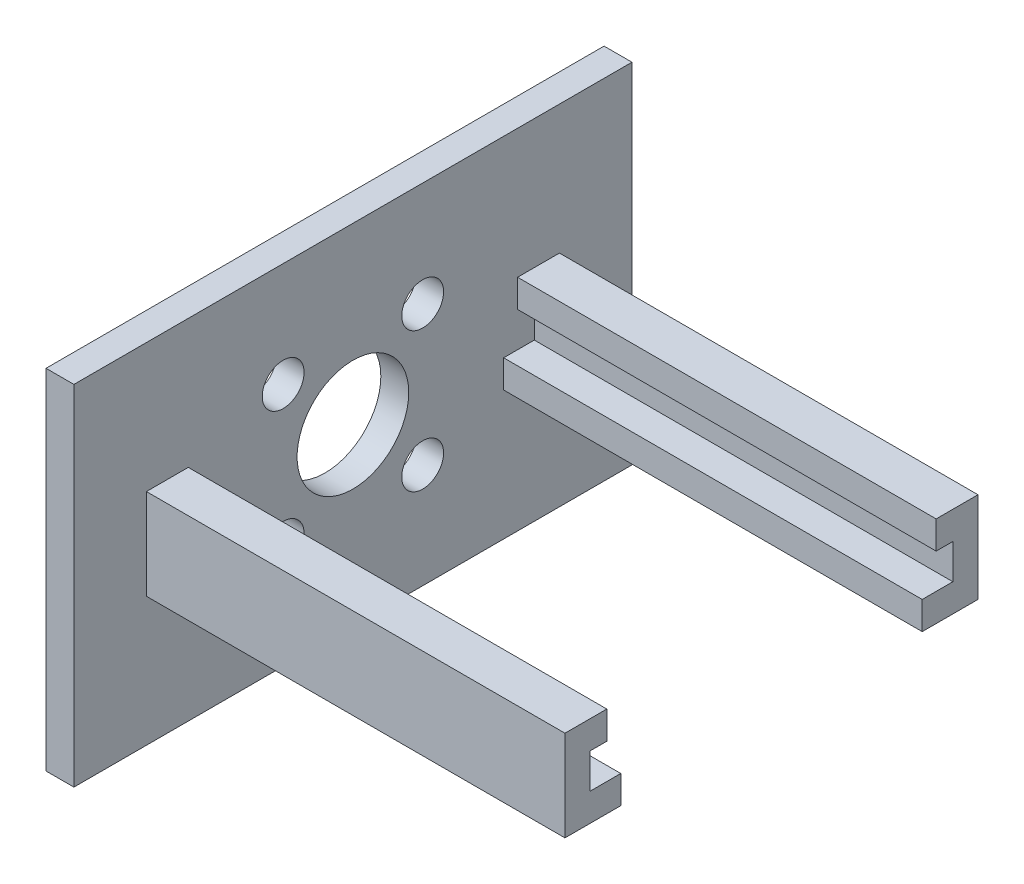
ISO-10303-21;
HEADER;
FILE_DESCRIPTION(('STEP AP214'),'2;1');
FILE_NAME('part.step','',(''),(''),'','','');
FILE_SCHEMA(('AUTOMOTIVE_DESIGN { 1 0 10303 214 1 1 1 1 }'));
ENDSEC;
DATA;
#1=APPLICATION_CONTEXT('core data for automotive mechanical design processes');
#2=APPLICATION_PROTOCOL_DEFINITION('international standard','automotive_design',2000,#1);
#3=PRODUCT_CONTEXT('',#1,'mechanical');
#4=PRODUCT('Part','Part','',(#3));
#5=PRODUCT_RELATED_PRODUCT_CATEGORY('part','',(#4));
#6=PRODUCT_DEFINITION_FORMATION('','',#4);
#7=PRODUCT_DEFINITION_CONTEXT('part definition',#1,'design');
#8=PRODUCT_DEFINITION('design','',#6,#7);
#9=PRODUCT_DEFINITION_SHAPE('','',#8);
#10=(LENGTH_UNIT() NAMED_UNIT(*) SI_UNIT(.MILLI.,.METRE.));
#11=(NAMED_UNIT(*) PLANE_ANGLE_UNIT() SI_UNIT($,.RADIAN.));
#12=(NAMED_UNIT(*) SI_UNIT($,.STERADIAN.) SOLID_ANGLE_UNIT());
#13=UNCERTAINTY_MEASURE_WITH_UNIT(LENGTH_MEASURE(1.E-05),#10,'distance_accuracy_value','');
#14=(GEOMETRIC_REPRESENTATION_CONTEXT(3) GLOBAL_UNCERTAINTY_ASSIGNED_CONTEXT((#13)) GLOBAL_UNIT_ASSIGNED_CONTEXT((#10,
#11,#12)) REPRESENTATION_CONTEXT('',''));
#15=CARTESIAN_POINT('',(0.,0.,0.));
#16=DIRECTION('',(0.,0.,1.));
#17=DIRECTION('',(1.,0.,0.));
#18=AXIS2_PLACEMENT_3D('',#15,#16,#17);
#19=CARTESIAN_POINT('',(2.,0.,0.));
#20=DIRECTION('',(1.,0.,0.));
#21=DIRECTION('',(0.,0.,-1.));
#22=AXIS2_PLACEMENT_3D('',#19,#20,#21);
#23=PLANE('',#22);
#24=CARTESIAN_POINT('',(2.,-5.,-5.));
#25=DIRECTION('',(1.,0.,0.));
#26=DIRECTION('',(0.,0.,-1.));
#27=AXIS2_PLACEMENT_3D('',#24,#25,#26);
#28=CIRCLE('',#27,1.5);
#29=CARTESIAN_POINT('',(2.,-5.,-6.5));
#30=VERTEX_POINT('',#29);
#31=EDGE_CURVE('E687',#30,#30,#28,.T.);
#32=ORIENTED_EDGE('',*,*,#31,.F.);
#33=EDGE_LOOP('',(#32));
#34=FACE_BOUND('',#33,.T.);
#35=CARTESIAN_POINT('',(2.,-5.,5.));
#36=DIRECTION('',(1.,0.,0.));
#37=DIRECTION('',(0.,0.,-1.));
#38=AXIS2_PLACEMENT_3D('',#35,#36,#37);
#39=CIRCLE('',#38,1.5);
#40=CARTESIAN_POINT('',(2.,-5.,3.5));
#41=VERTEX_POINT('',#40);
#42=EDGE_CURVE('E688',#41,#41,#39,.T.);
#43=ORIENTED_EDGE('',*,*,#42,.F.);
#44=EDGE_LOOP('',(#43));
#45=FACE_BOUND('',#44,.T.);
#46=CARTESIAN_POINT('',(2.,0.,0.));
#47=DIRECTION('',(1.,0.,0.));
#48=DIRECTION('',(0.,0.,-1.));
#49=AXIS2_PLACEMENT_3D('',#46,#47,#48);
#50=CIRCLE('',#49,4.);
#51=CARTESIAN_POINT('',(2.,0.,-4.));
#52=VERTEX_POINT('',#51);
#53=EDGE_CURVE('E696',#52,#52,#50,.T.);
#54=ORIENTED_EDGE('',*,*,#53,.F.);
#55=EDGE_LOOP('',(#54));
#56=FACE_BOUND('',#55,.T.);
#57=CARTESIAN_POINT('',(2.,5.,5.));
#58=DIRECTION('',(1.,0.,0.));
#59=DIRECTION('',(0.,0.,-1.));
#60=AXIS2_PLACEMENT_3D('',#57,#58,#59);
#61=CIRCLE('',#60,1.5);
#62=CARTESIAN_POINT('',(2.,5.,3.5));
#63=VERTEX_POINT('',#62);
#64=EDGE_CURVE('E692',#63,#63,#61,.T.);
#65=ORIENTED_EDGE('',*,*,#64,.F.);
#66=EDGE_LOOP('',(#65));
#67=FACE_BOUND('',#66,.T.);
#68=CARTESIAN_POINT('',(2.,5.,-5.));
#69=DIRECTION('',(1.,0.,0.));
#70=DIRECTION('',(0.,0.,-1.));
#71=AXIS2_PLACEMENT_3D('',#68,#69,#70);
#72=CIRCLE('',#71,1.5);
#73=CARTESIAN_POINT('',(2.,5.,-6.5));
#74=VERTEX_POINT('',#73);
#75=EDGE_CURVE('E308',#74,#74,#72,.T.);
#76=ORIENTED_EDGE('',*,*,#75,.F.);
#77=EDGE_LOOP('',(#76));
#78=FACE_BOUND('',#77,.T.);
#79=DIRECTION('',(0.,-1.,0.));
#80=VECTOR('',#79,1.);
#81=CARTESIAN_POINT('',(2.,12.5,20.));
#82=LINE('',#81,#80);
#83=CARTESIAN_POINT('',(2.,12.5,20.));
#84=VERTEX_POINT('',#83);
#85=CARTESIAN_POINT('',(2.,-12.5,20.));
#86=VERTEX_POINT('',#85);
#87=EDGE_CURVE('E275',#84,#86,#82,.T.);
#88=ORIENTED_EDGE('',*,*,#87,.T.);
#89=DIRECTION('',(0.,0.,-1.));
#90=VECTOR('',#89,1.);
#91=CARTESIAN_POINT('',(2.,-12.5,20.));
#92=LINE('',#91,#90);
#93=CARTESIAN_POINT('',(2.,-12.5,-20.));
#94=VERTEX_POINT('',#93);
#95=EDGE_CURVE('E278',#86,#94,#92,.T.);
#96=ORIENTED_EDGE('',*,*,#95,.T.);
#97=DIRECTION('',(0.,1.,0.));
#98=VECTOR('',#97,1.);
#99=CARTESIAN_POINT('',(2.,12.5,-20.));
#100=LINE('',#99,#98);
#101=CARTESIAN_POINT('',(2.,12.5,-20.));
#102=VERTEX_POINT('',#101);
#103=EDGE_CURVE('E281',#94,#102,#100,.T.);
#104=ORIENTED_EDGE('',*,*,#103,.T.);
#105=DIRECTION('',(0.,0.,1.));
#106=VECTOR('',#105,1.);
#107=CARTESIAN_POINT('',(2.,12.5,20.));
#108=LINE('',#107,#106);
#109=EDGE_CURVE('E284',#102,#84,#108,.T.);
#110=ORIENTED_EDGE('',*,*,#109,.T.);
#111=EDGE_LOOP('',(#88,#96,#104,#110));
#112=FACE_BOUND('',#111,.T.);
#113=DIRECTION('',(0.,0.,1.));
#114=VECTOR('',#113,1.);
#115=CARTESIAN_POINT('',(2.,3.25,-11.802707792877));
#116=LINE('',#115,#114);
#117=CARTESIAN_POINT('',(2.,3.25,-14.802707792877));
#118=VERTEX_POINT('',#117);
#119=CARTESIAN_POINT('',(2.,3.25,-11.802707792877));
#120=VERTEX_POINT('',#119);
#121=EDGE_CURVE('E204',#118,#120,#116,.T.);
#122=ORIENTED_EDGE('',*,*,#121,.F.);
#123=DIRECTION('',(0.,1.,0.));
#124=VECTOR('',#123,1.);
#125=CARTESIAN_POINT('',(2.,3.25,-14.802707792877));
#126=LINE('',#125,#124);
#127=CARTESIAN_POINT('',(2.,-3.25,-14.802707792877));
#128=VERTEX_POINT('',#127);
#129=EDGE_CURVE('E201',#128,#118,#126,.T.);
#130=ORIENTED_EDGE('',*,*,#129,.F.);
#131=DIRECTION('',(0.,0.,-1.));
#132=VECTOR('',#131,1.);
#133=CARTESIAN_POINT('',(2.,-3.25,-14.802707792877));
#134=LINE('',#133,#132);
#135=CARTESIAN_POINT('',(2.,-3.25,-10.802707792877));
#136=VERTEX_POINT('',#135);
#137=EDGE_CURVE('E228',#136,#128,#134,.T.);
#138=ORIENTED_EDGE('',*,*,#137,.F.);
#139=DIRECTION('',(0.,-1.,0.));
#140=VECTOR('',#139,1.);
#141=CARTESIAN_POINT('',(2.,-3.25,-10.802707792877));
#142=LINE('',#141,#140);
#143=CARTESIAN_POINT('',(2.,-1.25,-10.802707792877));
#144=VERTEX_POINT('',#143);
#145=EDGE_CURVE('E252',#144,#136,#142,.T.);
#146=ORIENTED_EDGE('',*,*,#145,.F.);
#147=DIRECTION('',(0.,0.,1.));
#148=VECTOR('',#147,1.);
#149=CARTESIAN_POINT('',(2.,-1.25,-10.802707792877));
#150=LINE('',#149,#148);
#151=CARTESIAN_POINT('',(2.,-1.25,-13.));
#152=VERTEX_POINT('',#151);
#153=EDGE_CURVE('E250',#152,#144,#150,.T.);
#154=ORIENTED_EDGE('',*,*,#153,.F.);
#155=DIRECTION('',(0.,-1.,0.));
#156=VECTOR('',#155,1.);
#157=CARTESIAN_POINT('',(2.,-1.25,-13.));
#158=LINE('',#157,#156);
#159=CARTESIAN_POINT('',(2.,1.25,-13.));
#160=VERTEX_POINT('',#159);
#161=EDGE_CURVE('E248',#160,#152,#158,.T.);
#162=ORIENTED_EDGE('',*,*,#161,.F.);
#163=DIRECTION('',(0.,0.,-1.));
#164=VECTOR('',#163,1.);
#165=CARTESIAN_POINT('',(2.,1.25,-13.));
#166=LINE('',#165,#164);
#167=CARTESIAN_POINT('',(2.,1.25,-11.802707792877));
#168=VERTEX_POINT('',#167);
#169=EDGE_CURVE('E246',#168,#160,#166,.T.);
#170=ORIENTED_EDGE('',*,*,#169,.F.);
#171=DIRECTION('',(0.,-1.,0.));
#172=VECTOR('',#171,1.);
#173=CARTESIAN_POINT('',(2.,1.25,-11.802707792877));
#174=LINE('',#173,#172);
#175=EDGE_CURVE('E244',#120,#168,#174,.T.);
#176=ORIENTED_EDGE('',*,*,#175,.F.);
#177=EDGE_LOOP('',(#122,#130,#138,#146,#154,#162,#170,#176));
#178=FACE_BOUND('',#177,.T.);
#179=DIRECTION('',(0.,1.,0.));
#180=VECTOR('',#179,1.);
#181=CARTESIAN_POINT('',(2.,-1.25,13.));
#182=LINE('',#181,#180);
#183=CARTESIAN_POINT('',(2.,-1.25,13.));
#184=VERTEX_POINT('',#183);
#185=CARTESIAN_POINT('',(2.,1.25,13.));
#186=VERTEX_POINT('',#185);
#187=EDGE_CURVE('E200',#184,#186,#182,.T.);
#188=ORIENTED_EDGE('',*,*,#187,.F.);
#189=DIRECTION('',(0.,0.,1.));
#190=VECTOR('',#189,1.);
#191=CARTESIAN_POINT('',(2.,-1.25,10.802707792877));
#192=LINE('',#191,#190);
#193=CARTESIAN_POINT('',(2.,-1.25,10.802707792877));
#194=VERTEX_POINT('',#193);
#195=EDGE_CURVE('E194',#194,#184,#192,.T.);
#196=ORIENTED_EDGE('',*,*,#195,.F.);
#197=DIRECTION('',(0.,1.,0.));
#198=VECTOR('',#197,1.);
#199=CARTESIAN_POINT('',(2.,-3.25,10.802707792877));
#200=LINE('',#199,#198);
#201=CARTESIAN_POINT('',(2.,-3.25,10.802707792877));
#202=VERTEX_POINT('',#201);
#203=EDGE_CURVE('E179',#202,#194,#200,.T.);
#204=ORIENTED_EDGE('',*,*,#203,.F.);
#205=DIRECTION('',(0.,0.,-1.));
#206=VECTOR('',#205,1.);
#207=CARTESIAN_POINT('',(2.,-3.25,14.802707792877));
#208=LINE('',#207,#206);
#209=CARTESIAN_POINT('',(2.,-3.25,14.802707792877));
#210=VERTEX_POINT('',#209);
#211=EDGE_CURVE('E187',#210,#202,#208,.T.);
#212=ORIENTED_EDGE('',*,*,#211,.F.);
#213=DIRECTION('',(0.,-1.,0.));
#214=VECTOR('',#213,1.);
#215=CARTESIAN_POINT('',(2.,3.25,14.802707792877));
#216=LINE('',#215,#214);
#217=CARTESIAN_POINT('',(2.,3.25,14.802707792877));
#218=VERTEX_POINT('',#217);
#219=EDGE_CURVE('E343',#218,#210,#216,.T.);
#220=ORIENTED_EDGE('',*,*,#219,.F.);
#221=DIRECTION('',(0.,0.,1.));
#222=VECTOR('',#221,1.);
#223=CARTESIAN_POINT('',(2.,3.25,11.802707792877));
#224=LINE('',#223,#222);
#225=CARTESIAN_POINT('',(2.,3.25,11.802707792877));
#226=VERTEX_POINT('',#225);
#227=EDGE_CURVE('E345',#226,#218,#224,.T.);
#228=ORIENTED_EDGE('',*,*,#227,.F.);
#229=DIRECTION('',(0.,1.,0.));
#230=VECTOR('',#229,1.);
#231=CARTESIAN_POINT('',(2.,1.25,11.802707792877));
#232=LINE('',#231,#230);
#233=CARTESIAN_POINT('',(2.,1.25,11.802707792877));
#234=VERTEX_POINT('',#233);
#235=EDGE_CURVE('E347',#234,#226,#232,.T.);
#236=ORIENTED_EDGE('',*,*,#235,.F.);
#237=DIRECTION('',(0.,0.,-1.));
#238=VECTOR('',#237,1.);
#239=CARTESIAN_POINT('',(2.,1.25,13.));
#240=LINE('',#239,#238);
#241=EDGE_CURVE('E206',#186,#234,#240,.T.);
#242=ORIENTED_EDGE('',*,*,#241,.F.);
#243=EDGE_LOOP('',(#188,#196,#204,#212,#220,#228,#236,#242));
#244=FACE_BOUND('',#243,.T.);
#245=ADVANCED_FACE('F39',(#34,#45,#56,#67,#78,#112,#178,#244),#23,.T.);
#246=CARTESIAN_POINT('',(1.,12.5,20.));
#247=DIRECTION('',(0.,0.,-1.));
#248=DIRECTION('',(-1.,0.,0.));
#249=AXIS2_PLACEMENT_3D('',#246,#247,#248);
#250=PLANE('',#249);
#251=DIRECTION('',(0.,-1.,0.));
#252=VECTOR('',#251,1.);
#253=CARTESIAN_POINT('',(0.,12.5,20.));
#254=LINE('',#253,#252);
#255=CARTESIAN_POINT('',(0.,12.5,20.));
#256=VERTEX_POINT('',#255);
#257=CARTESIAN_POINT('',(0.,-12.5,20.));
#258=VERTEX_POINT('',#257);
#259=EDGE_CURVE('E287',#256,#258,#254,.T.);
#260=ORIENTED_EDGE('',*,*,#259,.T.);
#261=DIRECTION('',(-1.,0.,0.));
#262=VECTOR('',#261,1.);
#263=CARTESIAN_POINT('',(1.,-12.5,20.));
#264=LINE('',#263,#262);
#265=EDGE_CURVE('E11',#86,#258,#264,.T.);
#266=ORIENTED_EDGE('',*,*,#265,.F.);
#267=ORIENTED_EDGE('',*,*,#87,.F.);
#268=DIRECTION('',(-1.,0.,0.));
#269=VECTOR('',#268,1.);
#270=CARTESIAN_POINT('',(1.,12.5,20.));
#271=LINE('',#270,#269);
#272=EDGE_CURVE('E296',#84,#256,#271,.T.);
#273=ORIENTED_EDGE('',*,*,#272,.T.);
#274=EDGE_LOOP('',(#260,#266,#267,#273));
#275=FACE_BOUND('',#274,.T.);
#276=ADVANCED_FACE('F41',(#275),#250,.F.);
#277=CARTESIAN_POINT('',(1.,-12.5,20.));
#278=DIRECTION('',(0.,1.,0.));
#279=DIRECTION('',(0.,0.,1.));
#280=AXIS2_PLACEMENT_3D('',#277,#278,#279);
#281=PLANE('',#280);
#282=DIRECTION('',(0.,0.,-1.));
#283=VECTOR('',#282,1.);
#284=CARTESIAN_POINT('',(0.,-12.5,20.));
#285=LINE('',#284,#283);
#286=CARTESIAN_POINT('',(0.,-12.5,-20.));
#287=VERTEX_POINT('',#286);
#288=EDGE_CURVE('E290',#258,#287,#285,.T.);
#289=ORIENTED_EDGE('',*,*,#288,.T.);
#290=DIRECTION('',(-1.,0.,0.));
#291=VECTOR('',#290,1.);
#292=CARTESIAN_POINT('',(1.,-12.5,-20.));
#293=LINE('',#292,#291);
#294=EDGE_CURVE('E48',#94,#287,#293,.T.);
#295=ORIENTED_EDGE('',*,*,#294,.F.);
#296=ORIENTED_EDGE('',*,*,#95,.F.);
#297=ORIENTED_EDGE('',*,*,#265,.T.);
#298=EDGE_LOOP('',(#289,#295,#296,#297));
#299=FACE_BOUND('',#298,.T.);
#300=ADVANCED_FACE('F389',(#299),#281,.F.);
#301=CARTESIAN_POINT('',(1.,12.5,-20.));
#302=DIRECTION('',(0.,0.,1.));
#303=DIRECTION('',(1.,0.,0.));
#304=AXIS2_PLACEMENT_3D('',#301,#302,#303);
#305=PLANE('',#304);
#306=DIRECTION('',(0.,1.,0.));
#307=VECTOR('',#306,1.);
#308=CARTESIAN_POINT('',(0.,12.5,-20.));
#309=LINE('',#308,#307);
#310=CARTESIAN_POINT('',(0.,12.5,-20.));
#311=VERTEX_POINT('',#310);
#312=EDGE_CURVE('E292',#287,#311,#309,.T.);
#313=ORIENTED_EDGE('',*,*,#312,.T.);
#314=DIRECTION('',(-1.,0.,0.));
#315=VECTOR('',#314,1.);
#316=CARTESIAN_POINT('',(1.,12.5,-20.));
#317=LINE('',#316,#315);
#318=EDGE_CURVE('E299',#102,#311,#317,.T.);
#319=ORIENTED_EDGE('',*,*,#318,.F.);
#320=ORIENTED_EDGE('',*,*,#103,.F.);
#321=ORIENTED_EDGE('',*,*,#294,.T.);
#322=EDGE_LOOP('',(#313,#319,#320,#321));
#323=FACE_BOUND('',#322,.T.);
#324=ADVANCED_FACE('F402',(#323),#305,.F.);
#325=CARTESIAN_POINT('',(1.,12.5,20.));
#326=DIRECTION('',(0.,-1.,0.));
#327=DIRECTION('',(0.,0.,-1.));
#328=AXIS2_PLACEMENT_3D('',#325,#326,#327);
#329=PLANE('',#328);
#330=DIRECTION('',(0.,0.,1.));
#331=VECTOR('',#330,1.);
#332=CARTESIAN_POINT('',(0.,12.5,20.));
#333=LINE('',#332,#331);
#334=EDGE_CURVE('E294',#311,#256,#333,.T.);
#335=ORIENTED_EDGE('',*,*,#334,.T.);
#336=ORIENTED_EDGE('',*,*,#272,.F.);
#337=ORIENTED_EDGE('',*,*,#109,.F.);
#338=ORIENTED_EDGE('',*,*,#318,.T.);
#339=EDGE_LOOP('',(#335,#336,#337,#338));
#340=FACE_BOUND('',#339,.T.);
#341=ADVANCED_FACE('F399',(#340),#329,.F.);
#342=CARTESIAN_POINT('',(0.,0.,0.));
#343=DIRECTION('',(1.,0.,0.));
#344=DIRECTION('',(0.,0.,-1.));
#345=AXIS2_PLACEMENT_3D('',#342,#343,#344);
#346=PLANE('',#345);
#347=CARTESIAN_POINT('',(0.,-5.,-5.));
#348=DIRECTION('',(1.,0.,0.));
#349=DIRECTION('',(0.,0.,-1.));
#350=AXIS2_PLACEMENT_3D('',#347,#348,#349);
#351=CIRCLE('',#350,1.5);
#352=CARTESIAN_POINT('',(0.,-5.,-6.5));
#353=VERTEX_POINT('',#352);
#354=EDGE_CURVE('E43',#353,#353,#351,.T.);
#355=ORIENTED_EDGE('',*,*,#354,.T.);
#356=EDGE_LOOP('',(#355));
#357=FACE_BOUND('',#356,.T.);
#358=CARTESIAN_POINT('',(0.,-5.,5.));
#359=DIRECTION('',(1.,0.,0.));
#360=DIRECTION('',(0.,0.,-1.));
#361=AXIS2_PLACEMENT_3D('',#358,#359,#360);
#362=CIRCLE('',#361,1.5);
#363=CARTESIAN_POINT('',(0.,-5.,3.5));
#364=VERTEX_POINT('',#363);
#365=EDGE_CURVE('E313',#364,#364,#362,.T.);
#366=ORIENTED_EDGE('',*,*,#365,.T.);
#367=EDGE_LOOP('',(#366));
#368=FACE_BOUND('',#367,.T.);
#369=CARTESIAN_POINT('',(0.,0.,0.));
#370=DIRECTION('',(1.,0.,0.));
#371=DIRECTION('',(0.,0.,-1.));
#372=AXIS2_PLACEMENT_3D('',#369,#370,#371);
#373=CIRCLE('',#372,4.);
#374=CARTESIAN_POINT('',(0.,0.,-4.));
#375=VERTEX_POINT('',#374);
#376=EDGE_CURVE('E311',#375,#375,#373,.T.);
#377=ORIENTED_EDGE('',*,*,#376,.T.);
#378=EDGE_LOOP('',(#377));
#379=FACE_BOUND('',#378,.T.);
#380=CARTESIAN_POINT('',(0.,5.,5.));
#381=DIRECTION('',(1.,0.,0.));
#382=DIRECTION('',(0.,0.,-1.));
#383=AXIS2_PLACEMENT_3D('',#380,#381,#382);
#384=CIRCLE('',#383,1.5);
#385=CARTESIAN_POINT('',(0.,5.,3.5));
#386=VERTEX_POINT('',#385);
#387=EDGE_CURVE('E307',#386,#386,#384,.T.);
#388=ORIENTED_EDGE('',*,*,#387,.T.);
#389=EDGE_LOOP('',(#388));
#390=FACE_BOUND('',#389,.T.);
#391=CARTESIAN_POINT('',(0.,5.,-5.));
#392=DIRECTION('',(1.,0.,0.));
#393=DIRECTION('',(0.,0.,-1.));
#394=AXIS2_PLACEMENT_3D('',#391,#392,#393);
#395=CIRCLE('',#394,1.5);
#396=CARTESIAN_POINT('',(0.,5.,-6.5));
#397=VERTEX_POINT('',#396);
#398=EDGE_CURVE('E304',#397,#397,#395,.T.);
#399=ORIENTED_EDGE('',*,*,#398,.T.);
#400=EDGE_LOOP('',(#399));
#401=FACE_BOUND('',#400,.T.);
#402=ORIENTED_EDGE('',*,*,#259,.F.);
#403=ORIENTED_EDGE('',*,*,#334,.F.);
#404=ORIENTED_EDGE('',*,*,#312,.F.);
#405=ORIENTED_EDGE('',*,*,#288,.F.);
#406=EDGE_LOOP('',(#402,#403,#404,#405));
#407=FACE_BOUND('',#406,.T.);
#408=ADVANCED_FACE('F397',(#357,#368,#379,#390,#401,#407),#346,.F.);
#409=CARTESIAN_POINT('',(32.,3.25,-14.802707792877));
#410=DIRECTION('',(0.,0.,1.));
#411=DIRECTION('',(1.,0.,0.));
#412=AXIS2_PLACEMENT_3D('',#409,#410,#411);
#413=PLANE('',#412);
#414=ORIENTED_EDGE('',*,*,#129,.T.);
#415=DIRECTION('',(-1.,0.,0.));
#416=VECTOR('',#415,1.);
#417=CARTESIAN_POINT('',(32.,3.25,-14.802707792877));
#418=LINE('',#417,#416);
#419=CARTESIAN_POINT('',(32.,3.25,-14.802707792877));
#420=VERTEX_POINT('',#419);
#421=EDGE_CURVE('E273',#420,#118,#418,.T.);
#422=ORIENTED_EDGE('',*,*,#421,.F.);
#423=DIRECTION('',(0.,1.,0.));
#424=VECTOR('',#423,1.);
#425=CARTESIAN_POINT('',(32.,3.25,-14.802707792877));
#426=LINE('',#425,#424);
#427=CARTESIAN_POINT('',(32.,-3.25,-14.802707792877));
#428=VERTEX_POINT('',#427);
#429=EDGE_CURVE('E224',#428,#420,#426,.T.);
#430=ORIENTED_EDGE('',*,*,#429,.F.);
#431=DIRECTION('',(-1.,0.,0.));
#432=VECTOR('',#431,1.);
#433=CARTESIAN_POINT('',(32.,-3.25,-14.802707792877));
#434=LINE('',#433,#432);
#435=EDGE_CURVE('E241',#428,#128,#434,.T.);
#436=ORIENTED_EDGE('',*,*,#435,.T.);
#437=EDGE_LOOP('',(#414,#422,#430,#436));
#438=FACE_BOUND('',#437,.T.);
#439=ADVANCED_FACE('F395',(#438),#413,.F.);
#440=CARTESIAN_POINT('',(32.,3.25,-11.802707792877));
#441=DIRECTION('',(0.,-1.,0.));
#442=DIRECTION('',(0.,0.,-1.));
#443=AXIS2_PLACEMENT_3D('',#440,#441,#442);
#444=PLANE('',#443);
#445=ORIENTED_EDGE('',*,*,#121,.T.);
#446=DIRECTION('',(-1.,0.,0.));
#447=VECTOR('',#446,1.);
#448=CARTESIAN_POINT('',(32.,3.25,-11.802707792877));
#449=LINE('',#448,#447);
#450=CARTESIAN_POINT('',(32.,3.25,-11.802707792877));
#451=VERTEX_POINT('',#450);
#452=EDGE_CURVE('E270',#451,#120,#449,.T.);
#453=ORIENTED_EDGE('',*,*,#452,.F.);
#454=DIRECTION('',(0.,0.,1.));
#455=VECTOR('',#454,1.);
#456=CARTESIAN_POINT('',(32.,3.25,-11.802707792877));
#457=LINE('',#456,#455);
#458=EDGE_CURVE('E227',#420,#451,#457,.T.);
#459=ORIENTED_EDGE('',*,*,#458,.F.);
#460=ORIENTED_EDGE('',*,*,#421,.T.);
#461=EDGE_LOOP('',(#445,#453,#459,#460));
#462=FACE_BOUND('',#461,.T.);
#463=ADVANCED_FACE('F427',(#462),#444,.F.);
#464=CARTESIAN_POINT('',(32.,1.25,-11.802707792877));
#465=DIRECTION('',(0.,0.,-1.));
#466=DIRECTION('',(-1.,0.,0.));
#467=AXIS2_PLACEMENT_3D('',#464,#465,#466);
#468=PLANE('',#467);
#469=ORIENTED_EDGE('',*,*,#175,.T.);
#470=DIRECTION('',(-1.,0.,0.));
#471=VECTOR('',#470,1.);
#472=CARTESIAN_POINT('',(32.,1.25,-11.802707792877));
#473=LINE('',#472,#471);
#474=CARTESIAN_POINT('',(32.,1.25,-11.802707792877));
#475=VERTEX_POINT('',#474);
#476=EDGE_CURVE('E267',#475,#168,#473,.T.);
#477=ORIENTED_EDGE('',*,*,#476,.F.);
#478=DIRECTION('',(0.,-1.,0.));
#479=VECTOR('',#478,1.);
#480=CARTESIAN_POINT('',(32.,1.25,-11.802707792877));
#481=LINE('',#480,#479);
#482=EDGE_CURVE('E230',#451,#475,#481,.T.);
#483=ORIENTED_EDGE('',*,*,#482,.F.);
#484=ORIENTED_EDGE('',*,*,#452,.T.);
#485=EDGE_LOOP('',(#469,#477,#483,#484));
#486=FACE_BOUND('',#485,.T.);
#487=ADVANCED_FACE('F431',(#486),#468,.F.);
#488=CARTESIAN_POINT('',(32.,1.25,-13.));
#489=DIRECTION('',(0.,1.,0.));
#490=DIRECTION('',(0.,0.,1.));
#491=AXIS2_PLACEMENT_3D('',#488,#489,#490);
#492=PLANE('',#491);
#493=ORIENTED_EDGE('',*,*,#169,.T.);
#494=DIRECTION('',(-1.,0.,0.));
#495=VECTOR('',#494,1.);
#496=CARTESIAN_POINT('',(32.,1.25,-13.));
#497=LINE('',#496,#495);
#498=CARTESIAN_POINT('',(32.,1.25,-13.));
#499=VERTEX_POINT('',#498);
#500=EDGE_CURVE('E264',#499,#160,#497,.T.);
#501=ORIENTED_EDGE('',*,*,#500,.F.);
#502=DIRECTION('',(0.,0.,-1.));
#503=VECTOR('',#502,1.);
#504=CARTESIAN_POINT('',(32.,1.25,-13.));
#505=LINE('',#504,#503);
#506=EDGE_CURVE('E232',#475,#499,#505,.T.);
#507=ORIENTED_EDGE('',*,*,#506,.F.);
#508=ORIENTED_EDGE('',*,*,#476,.T.);
#509=EDGE_LOOP('',(#493,#501,#507,#508));
#510=FACE_BOUND('',#509,.T.);
#511=ADVANCED_FACE('F455',(#510),#492,.F.);
#512=CARTESIAN_POINT('',(32.,-1.25,-13.));
#513=DIRECTION('',(0.,0.,-1.));
#514=DIRECTION('',(-1.,0.,0.));
#515=AXIS2_PLACEMENT_3D('',#512,#513,#514);
#516=PLANE('',#515);
#517=ORIENTED_EDGE('',*,*,#161,.T.);
#518=DIRECTION('',(-1.,0.,0.));
#519=VECTOR('',#518,1.);
#520=CARTESIAN_POINT('',(32.,-1.25,-13.));
#521=LINE('',#520,#519);
#522=CARTESIAN_POINT('',(32.,-1.25,-13.));
#523=VERTEX_POINT('',#522);
#524=EDGE_CURVE('E261',#523,#152,#521,.T.);
#525=ORIENTED_EDGE('',*,*,#524,.F.);
#526=DIRECTION('',(0.,-1.,0.));
#527=VECTOR('',#526,1.);
#528=CARTESIAN_POINT('',(32.,-1.25,-13.));
#529=LINE('',#528,#527);
#530=EDGE_CURVE('E234',#499,#523,#529,.T.);
#531=ORIENTED_EDGE('',*,*,#530,.F.);
#532=ORIENTED_EDGE('',*,*,#500,.T.);
#533=EDGE_LOOP('',(#517,#525,#531,#532));
#534=FACE_BOUND('',#533,.T.);
#535=ADVANCED_FACE('F453',(#534),#516,.F.);
#536=CARTESIAN_POINT('',(32.,-1.25,-10.802707792877));
#537=DIRECTION('',(0.,-1.,0.));
#538=DIRECTION('',(0.,0.,-1.));
#539=AXIS2_PLACEMENT_3D('',#536,#537,#538);
#540=PLANE('',#539);
#541=ORIENTED_EDGE('',*,*,#153,.T.);
#542=DIRECTION('',(-1.,0.,0.));
#543=VECTOR('',#542,1.);
#544=CARTESIAN_POINT('',(32.,-1.25,-10.802707792877));
#545=LINE('',#544,#543);
#546=CARTESIAN_POINT('',(32.,-1.25,-10.802707792877));
#547=VERTEX_POINT('',#546);
#548=EDGE_CURVE('E258',#547,#144,#545,.T.);
#549=ORIENTED_EDGE('',*,*,#548,.F.);
#550=DIRECTION('',(0.,0.,1.));
#551=VECTOR('',#550,1.);
#552=CARTESIAN_POINT('',(32.,-1.25,-10.802707792877));
#553=LINE('',#552,#551);
#554=EDGE_CURVE('E236',#523,#547,#553,.T.);
#555=ORIENTED_EDGE('',*,*,#554,.F.);
#556=ORIENTED_EDGE('',*,*,#524,.T.);
#557=EDGE_LOOP('',(#541,#549,#555,#556));
#558=FACE_BOUND('',#557,.T.);
#559=ADVANCED_FACE('F449',(#558),#540,.F.);
#560=CARTESIAN_POINT('',(32.,-3.25,-10.802707792877));
#561=DIRECTION('',(0.,0.,-1.));
#562=DIRECTION('',(-1.,0.,0.));
#563=AXIS2_PLACEMENT_3D('',#560,#561,#562);
#564=PLANE('',#563);
#565=ORIENTED_EDGE('',*,*,#145,.T.);
#566=DIRECTION('',(-1.,0.,0.));
#567=VECTOR('',#566,1.);
#568=CARTESIAN_POINT('',(32.,-3.25,-10.802707792877));
#569=LINE('',#568,#567);
#570=CARTESIAN_POINT('',(32.,-3.25,-10.802707792877));
#571=VERTEX_POINT('',#570);
#572=EDGE_CURVE('E64',#571,#136,#569,.T.);
#573=ORIENTED_EDGE('',*,*,#572,.F.);
#574=DIRECTION('',(0.,-1.,0.));
#575=VECTOR('',#574,1.);
#576=CARTESIAN_POINT('',(32.,-3.25,-10.802707792877));
#577=LINE('',#576,#575);
#578=EDGE_CURVE('E238',#547,#571,#577,.T.);
#579=ORIENTED_EDGE('',*,*,#578,.F.);
#580=ORIENTED_EDGE('',*,*,#548,.T.);
#581=EDGE_LOOP('',(#565,#573,#579,#580));
#582=FACE_BOUND('',#581,.T.);
#583=ADVANCED_FACE('F444',(#582),#564,.F.);
#584=CARTESIAN_POINT('',(32.,-3.25,-14.802707792877));
#585=DIRECTION('',(0.,1.,0.));
#586=DIRECTION('',(0.,0.,1.));
#587=AXIS2_PLACEMENT_3D('',#584,#585,#586);
#588=PLANE('',#587);
#589=ORIENTED_EDGE('',*,*,#137,.T.);
#590=ORIENTED_EDGE('',*,*,#435,.F.);
#591=DIRECTION('',(0.,0.,-1.));
#592=VECTOR('',#591,1.);
#593=CARTESIAN_POINT('',(32.,-3.25,-14.802707792877));
#594=LINE('',#593,#592);
#595=EDGE_CURVE('E240',#571,#428,#594,.T.);
#596=ORIENTED_EDGE('',*,*,#595,.F.);
#597=ORIENTED_EDGE('',*,*,#572,.T.);
#598=EDGE_LOOP('',(#589,#590,#596,#597));
#599=FACE_BOUND('',#598,.T.);
#600=ADVANCED_FACE('F439',(#599),#588,.F.);
#601=CARTESIAN_POINT('',(32.,0.,0.));
#602=DIRECTION('',(-1.,0.,0.));
#603=DIRECTION('',(0.,0.,1.));
#604=AXIS2_PLACEMENT_3D('',#601,#602,#603);
#605=PLANE('',#604);
#606=ORIENTED_EDGE('',*,*,#429,.T.);
#607=ORIENTED_EDGE('',*,*,#458,.T.);
#608=ORIENTED_EDGE('',*,*,#482,.T.);
#609=ORIENTED_EDGE('',*,*,#506,.T.);
#610=ORIENTED_EDGE('',*,*,#530,.T.);
#611=ORIENTED_EDGE('',*,*,#554,.T.);
#612=ORIENTED_EDGE('',*,*,#578,.T.);
#613=ORIENTED_EDGE('',*,*,#595,.T.);
#614=EDGE_LOOP('',(#606,#607,#608,#609,#610,#611,#612,#613));
#615=FACE_BOUND('',#614,.T.);
#616=ADVANCED_FACE('F379',(#615),#605,.F.);
#617=CARTESIAN_POINT('',(32.,-1.25,10.802707792877));
#618=DIRECTION('',(0.,-1.,0.));
#619=DIRECTION('',(0.,0.,-1.));
#620=AXIS2_PLACEMENT_3D('',#617,#618,#619);
#621=PLANE('',#620);
#622=ORIENTED_EDGE('',*,*,#195,.T.);
#623=DIRECTION('',(-1.,0.,0.));
#624=VECTOR('',#623,1.);
#625=CARTESIAN_POINT('',(32.,-1.25,13.));
#626=LINE('',#625,#624);
#627=CARTESIAN_POINT('',(32.,-1.25,13.));
#628=VERTEX_POINT('',#627);
#629=EDGE_CURVE('E318',#628,#184,#626,.T.);
#630=ORIENTED_EDGE('',*,*,#629,.F.);
#631=DIRECTION('',(0.,0.,1.));
#632=VECTOR('',#631,1.);
#633=CARTESIAN_POINT('',(32.,-1.25,10.802707792877));
#634=LINE('',#633,#632);
#635=CARTESIAN_POINT('',(32.,-1.25,10.802707792877));
#636=VERTEX_POINT('',#635);
#637=EDGE_CURVE('E188',#636,#628,#634,.T.);
#638=ORIENTED_EDGE('',*,*,#637,.F.);
#639=DIRECTION('',(-1.,0.,0.));
#640=VECTOR('',#639,1.);
#641=CARTESIAN_POINT('',(32.,-1.25,10.802707792877));
#642=LINE('',#641,#640);
#643=EDGE_CURVE('E182',#636,#194,#642,.T.);
#644=ORIENTED_EDGE('',*,*,#643,.T.);
#645=EDGE_LOOP('',(#622,#630,#638,#644));
#646=FACE_BOUND('',#645,.T.);
#647=ADVANCED_FACE('F192',(#646),#621,.F.);
#648=CARTESIAN_POINT('',(32.,-1.25,13.));
#649=DIRECTION('',(0.,0.,1.));
#650=DIRECTION('',(1.,0.,0.));
#651=AXIS2_PLACEMENT_3D('',#648,#649,#650);
#652=PLANE('',#651);
#653=ORIENTED_EDGE('',*,*,#187,.T.);
#654=DIRECTION('',(-1.,0.,0.));
#655=VECTOR('',#654,1.);
#656=CARTESIAN_POINT('',(32.,1.25,13.));
#657=LINE('',#656,#655);
#658=CARTESIAN_POINT('',(32.,1.25,13.));
#659=VERTEX_POINT('',#658);
#660=EDGE_CURVE('E321',#659,#186,#657,.T.);
#661=ORIENTED_EDGE('',*,*,#660,.F.);
#662=DIRECTION('',(0.,1.,0.));
#663=VECTOR('',#662,1.);
#664=CARTESIAN_POINT('',(32.,-1.25,13.));
#665=LINE('',#664,#663);
#666=EDGE_CURVE('E221',#628,#659,#665,.T.);
#667=ORIENTED_EDGE('',*,*,#666,.F.);
#668=ORIENTED_EDGE('',*,*,#629,.T.);
#669=EDGE_LOOP('',(#653,#661,#667,#668));
#670=FACE_BOUND('',#669,.T.);
#671=ADVANCED_FACE('F371',(#670),#652,.F.);
#672=CARTESIAN_POINT('',(32.,1.25,13.));
#673=DIRECTION('',(0.,1.,0.));
#674=DIRECTION('',(0.,0.,1.));
#675=AXIS2_PLACEMENT_3D('',#672,#673,#674);
#676=PLANE('',#675);
#677=ORIENTED_EDGE('',*,*,#241,.T.);
#678=DIRECTION('',(-1.,0.,0.));
#679=VECTOR('',#678,1.);
#680=CARTESIAN_POINT('',(32.,1.25,11.802707792877));
#681=LINE('',#680,#679);
#682=CARTESIAN_POINT('',(32.,1.25,11.802707792877));
#683=VERTEX_POINT('',#682);
#684=EDGE_CURVE('E325',#683,#234,#681,.T.);
#685=ORIENTED_EDGE('',*,*,#684,.F.);
#686=DIRECTION('',(0.,0.,-1.));
#687=VECTOR('',#686,1.);
#688=CARTESIAN_POINT('',(32.,1.25,13.));
#689=LINE('',#688,#687);
#690=EDGE_CURVE('E219',#659,#683,#689,.T.);
#691=ORIENTED_EDGE('',*,*,#690,.F.);
#692=ORIENTED_EDGE('',*,*,#660,.T.);
#693=EDGE_LOOP('',(#677,#685,#691,#692));
#694=FACE_BOUND('',#693,.T.);
#695=ADVANCED_FACE('F350',(#694),#676,.F.);
#696=CARTESIAN_POINT('',(32.,1.25,11.802707792877));
#697=DIRECTION('',(0.,0.,1.));
#698=DIRECTION('',(1.,0.,0.));
#699=AXIS2_PLACEMENT_3D('',#696,#697,#698);
#700=PLANE('',#699);
#701=ORIENTED_EDGE('',*,*,#235,.T.);
#702=DIRECTION('',(-1.,0.,0.));
#703=VECTOR('',#702,1.);
#704=CARTESIAN_POINT('',(32.,3.25,11.802707792877));
#705=LINE('',#704,#703);
#706=CARTESIAN_POINT('',(32.,3.25,11.802707792877));
#707=VERTEX_POINT('',#706);
#708=EDGE_CURVE('E332',#707,#226,#705,.T.);
#709=ORIENTED_EDGE('',*,*,#708,.F.);
#710=DIRECTION('',(0.,1.,0.));
#711=VECTOR('',#710,1.);
#712=CARTESIAN_POINT('',(32.,1.25,11.802707792877));
#713=LINE('',#712,#711);
#714=EDGE_CURVE('E217',#683,#707,#713,.T.);
#715=ORIENTED_EDGE('',*,*,#714,.F.);
#716=ORIENTED_EDGE('',*,*,#684,.T.);
#717=EDGE_LOOP('',(#701,#709,#715,#716));
#718=FACE_BOUND('',#717,.T.);
#719=ADVANCED_FACE('F356',(#718),#700,.F.);
#720=CARTESIAN_POINT('',(32.,3.25,11.802707792877));
#721=DIRECTION('',(0.,-1.,0.));
#722=DIRECTION('',(0.,0.,-1.));
#723=AXIS2_PLACEMENT_3D('',#720,#721,#722);
#724=PLANE('',#723);
#725=ORIENTED_EDGE('',*,*,#227,.T.);
#726=DIRECTION('',(-1.,0.,0.));
#727=VECTOR('',#726,1.);
#728=CARTESIAN_POINT('',(32.,3.25,14.802707792877));
#729=LINE('',#728,#727);
#730=CARTESIAN_POINT('',(32.,3.25,14.802707792877));
#731=VERTEX_POINT('',#730);
#732=EDGE_CURVE('E335',#731,#218,#729,.T.);
#733=ORIENTED_EDGE('',*,*,#732,.F.);
#734=DIRECTION('',(0.,0.,1.));
#735=VECTOR('',#734,1.);
#736=CARTESIAN_POINT('',(32.,3.25,11.802707792877));
#737=LINE('',#736,#735);
#738=EDGE_CURVE('E215',#707,#731,#737,.T.);
#739=ORIENTED_EDGE('',*,*,#738,.F.);
#740=ORIENTED_EDGE('',*,*,#708,.T.);
#741=EDGE_LOOP('',(#725,#733,#739,#740));
#742=FACE_BOUND('',#741,.T.);
#743=ADVANCED_FACE('F362',(#742),#724,.F.);
#744=CARTESIAN_POINT('',(32.,3.25,14.802707792877));
#745=DIRECTION('',(0.,0.,-1.));
#746=DIRECTION('',(-1.,0.,0.));
#747=AXIS2_PLACEMENT_3D('',#744,#745,#746);
#748=PLANE('',#747);
#749=ORIENTED_EDGE('',*,*,#219,.T.);
#750=DIRECTION('',(-1.,0.,0.));
#751=VECTOR('',#750,1.);
#752=CARTESIAN_POINT('',(32.,-3.25,14.802707792877));
#753=LINE('',#752,#751);
#754=CARTESIAN_POINT('',(32.,-3.25,14.802707792877));
#755=VERTEX_POINT('',#754);
#756=EDGE_CURVE('E338',#755,#210,#753,.T.);
#757=ORIENTED_EDGE('',*,*,#756,.F.);
#758=DIRECTION('',(0.,-1.,0.));
#759=VECTOR('',#758,1.);
#760=CARTESIAN_POINT('',(32.,3.25,14.802707792877));
#761=LINE('',#760,#759);
#762=EDGE_CURVE('E213',#731,#755,#761,.T.);
#763=ORIENTED_EDGE('',*,*,#762,.F.);
#764=ORIENTED_EDGE('',*,*,#732,.T.);
#765=EDGE_LOOP('',(#749,#757,#763,#764));
#766=FACE_BOUND('',#765,.T.);
#767=ADVANCED_FACE('F366',(#766),#748,.F.);
#768=CARTESIAN_POINT('',(32.,-3.25,14.802707792877));
#769=DIRECTION('',(0.,1.,0.));
#770=DIRECTION('',(0.,0.,1.));
#771=AXIS2_PLACEMENT_3D('',#768,#769,#770);
#772=PLANE('',#771);
#773=ORIENTED_EDGE('',*,*,#211,.T.);
#774=DIRECTION('',(-1.,0.,0.));
#775=VECTOR('',#774,1.);
#776=CARTESIAN_POINT('',(32.,-3.25,10.802707792877));
#777=LINE('',#776,#775);
#778=CARTESIAN_POINT('',(32.,-3.25,10.802707792877));
#779=VERTEX_POINT('',#778);
#780=EDGE_CURVE('E56',#779,#202,#777,.T.);
#781=ORIENTED_EDGE('',*,*,#780,.F.);
#782=DIRECTION('',(0.,0.,-1.));
#783=VECTOR('',#782,1.);
#784=CARTESIAN_POINT('',(32.,-3.25,14.802707792877));
#785=LINE('',#784,#783);
#786=EDGE_CURVE('E211',#755,#779,#785,.T.);
#787=ORIENTED_EDGE('',*,*,#786,.F.);
#788=ORIENTED_EDGE('',*,*,#756,.T.);
#789=EDGE_LOOP('',(#773,#781,#787,#788));
#790=FACE_BOUND('',#789,.T.);
#791=ADVANCED_FACE('F576',(#790),#772,.F.);
#792=CARTESIAN_POINT('',(32.,-3.25,10.802707792877));
#793=DIRECTION('',(0.,0.,1.));
#794=DIRECTION('',(1.,0.,0.));
#795=AXIS2_PLACEMENT_3D('',#792,#793,#794);
#796=PLANE('',#795);
#797=ORIENTED_EDGE('',*,*,#203,.T.);
#798=ORIENTED_EDGE('',*,*,#643,.F.);
#799=DIRECTION('',(0.,1.,0.));
#800=VECTOR('',#799,1.);
#801=CARTESIAN_POINT('',(32.,-3.25,10.802707792877));
#802=LINE('',#801,#800);
#803=EDGE_CURVE('E197',#779,#636,#802,.T.);
#804=ORIENTED_EDGE('',*,*,#803,.F.);
#805=ORIENTED_EDGE('',*,*,#780,.T.);
#806=EDGE_LOOP('',(#797,#798,#804,#805));
#807=FACE_BOUND('',#806,.T.);
#808=ADVANCED_FACE('F181',(#807),#796,.F.);
#809=CARTESIAN_POINT('',(32.,0.,0.));
#810=DIRECTION('',(-1.,0.,0.));
#811=DIRECTION('',(0.,0.,1.));
#812=AXIS2_PLACEMENT_3D('',#809,#810,#811);
#813=PLANE('',#812);
#814=ORIENTED_EDGE('',*,*,#637,.T.);
#815=ORIENTED_EDGE('',*,*,#666,.T.);
#816=ORIENTED_EDGE('',*,*,#690,.T.);
#817=ORIENTED_EDGE('',*,*,#714,.T.);
#818=ORIENTED_EDGE('',*,*,#738,.T.);
#819=ORIENTED_EDGE('',*,*,#762,.T.);
#820=ORIENTED_EDGE('',*,*,#786,.T.);
#821=ORIENTED_EDGE('',*,*,#803,.T.);
#822=EDGE_LOOP('',(#814,#815,#816,#817,#818,#819,#820,#821));
#823=FACE_BOUND('',#822,.T.);
#824=ADVANCED_FACE('F370',(#823),#813,.F.);
#825=CARTESIAN_POINT('',(-8.,5.,-5.));
#826=DIRECTION('',(1.,0.,0.));
#827=DIRECTION('',(0.,0.,-1.));
#828=AXIS2_PLACEMENT_3D('',#825,#826,#827);
#829=CYLINDRICAL_SURFACE('',#828,1.5);
#830=ORIENTED_EDGE('',*,*,#75,.T.);
#831=EDGE_LOOP('',(#830));
#832=FACE_BOUND('',#831,.T.);
#833=ORIENTED_EDGE('',*,*,#398,.F.);
#834=EDGE_LOOP('',(#833));
#835=FACE_BOUND('',#834,.T.);
#836=ADVANCED_FACE('F516',(#832,#835),#829,.F.);
#837=CARTESIAN_POINT('',(-8.,5.,5.));
#838=DIRECTION('',(1.,0.,0.));
#839=DIRECTION('',(0.,0.,-1.));
#840=AXIS2_PLACEMENT_3D('',#837,#838,#839);
#841=CYLINDRICAL_SURFACE('',#840,1.5);
#842=ORIENTED_EDGE('',*,*,#64,.T.);
#843=EDGE_LOOP('',(#842));
#844=FACE_BOUND('',#843,.T.);
#845=ORIENTED_EDGE('',*,*,#387,.F.);
#846=EDGE_LOOP('',(#845));
#847=FACE_BOUND('',#846,.T.);
#848=ADVANCED_FACE('F520',(#844,#847),#841,.F.);
#849=CARTESIAN_POINT('',(-8.,0.,0.));
#850=DIRECTION('',(1.,0.,0.));
#851=DIRECTION('',(0.,0.,-1.));
#852=AXIS2_PLACEMENT_3D('',#849,#850,#851);
#853=CYLINDRICAL_SURFACE('',#852,4.);
#854=ORIENTED_EDGE('',*,*,#53,.T.);
#855=EDGE_LOOP('',(#854));
#856=FACE_BOUND('',#855,.T.);
#857=ORIENTED_EDGE('',*,*,#376,.F.);
#858=EDGE_LOOP('',(#857));
#859=FACE_BOUND('',#858,.T.);
#860=ADVANCED_FACE('F530',(#856,#859),#853,.F.);
#861=CARTESIAN_POINT('',(-8.,-5.,5.));
#862=DIRECTION('',(1.,0.,0.));
#863=DIRECTION('',(0.,0.,-1.));
#864=AXIS2_PLACEMENT_3D('',#861,#862,#863);
#865=CYLINDRICAL_SURFACE('',#864,1.5);
#866=ORIENTED_EDGE('',*,*,#42,.T.);
#867=EDGE_LOOP('',(#866));
#868=FACE_BOUND('',#867,.T.);
#869=ORIENTED_EDGE('',*,*,#365,.F.);
#870=EDGE_LOOP('',(#869));
#871=FACE_BOUND('',#870,.T.);
#872=ADVANCED_FACE('F539',(#868,#871),#865,.F.);
#873=CARTESIAN_POINT('',(-8.,-5.,-5.));
#874=DIRECTION('',(1.,0.,0.));
#875=DIRECTION('',(0.,0.,-1.));
#876=AXIS2_PLACEMENT_3D('',#873,#874,#875);
#877=CYLINDRICAL_SURFACE('',#876,1.5);
#878=ORIENTED_EDGE('',*,*,#31,.T.);
#879=EDGE_LOOP('',(#878));
#880=FACE_BOUND('',#879,.T.);
#881=ORIENTED_EDGE('',*,*,#354,.F.);
#882=EDGE_LOOP('',(#881));
#883=FACE_BOUND('',#882,.T.);
#884=ADVANCED_FACE('F548',(#880,#883),#877,.F.);
#885=CLOSED_SHELL('',(#245,#276,#300,#324,#341,#408,#439,#463,#487,#511,#535,#559,#583,#600,
#616,#647,#671,#695,#719,#743,#767,#791,#808,#824,#836,#848,#860,#872,#884));
#886=MANIFOLD_SOLID_BREP('B2',#885);
#887=ADVANCED_BREP_SHAPE_REPRESENTATION('',(#18,#886),#14);
#888=SHAPE_DEFINITION_REPRESENTATION(#9,#887);
ENDSEC;
END-ISO-10303-21;
